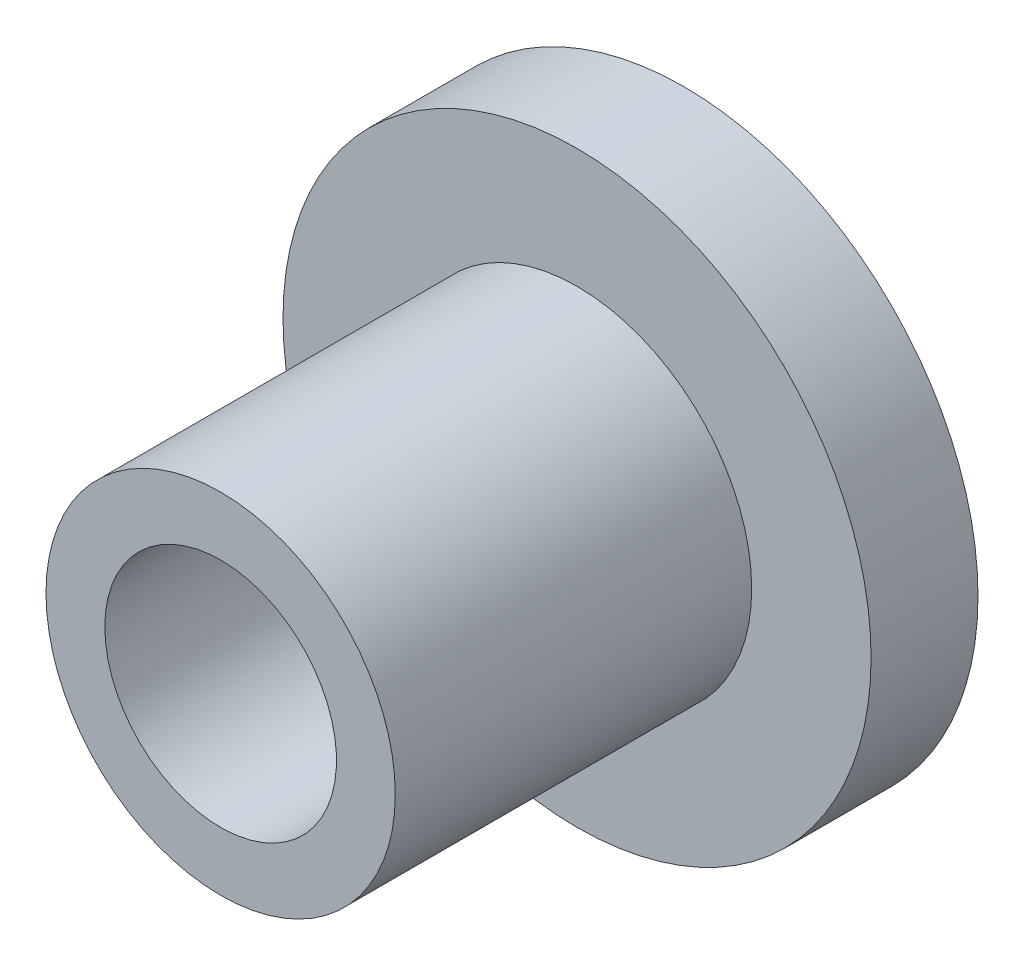
ISO-10303-21;
HEADER;
FILE_DESCRIPTION(('STEP AP214'),'2;1');
FILE_NAME('part.step','',(''),(''),'','','');
FILE_SCHEMA(('AUTOMOTIVE_DESIGN { 1 0 10303 214 1 1 1 1 }'));
ENDSEC;
DATA;
#1=APPLICATION_CONTEXT('core data for automotive mechanical design processes');
#2=APPLICATION_PROTOCOL_DEFINITION('international standard','automotive_design',2000,#1);
#3=PRODUCT_CONTEXT('',#1,'mechanical');
#4=PRODUCT('Part','Part','',(#3));
#5=PRODUCT_RELATED_PRODUCT_CATEGORY('part','',(#4));
#6=PRODUCT_DEFINITION_FORMATION('','',#4);
#7=PRODUCT_DEFINITION_CONTEXT('part definition',#1,'design');
#8=PRODUCT_DEFINITION('design','',#6,#7);
#9=PRODUCT_DEFINITION_SHAPE('','',#8);
#10=(LENGTH_UNIT() NAMED_UNIT(*) SI_UNIT(.MILLI.,.METRE.));
#11=(NAMED_UNIT(*) PLANE_ANGLE_UNIT() SI_UNIT($,.RADIAN.));
#12=(NAMED_UNIT(*) SI_UNIT($,.STERADIAN.) SOLID_ANGLE_UNIT());
#13=UNCERTAINTY_MEASURE_WITH_UNIT(LENGTH_MEASURE(1.E-05),#10,'distance_accuracy_value','');
#14=(GEOMETRIC_REPRESENTATION_CONTEXT(3) GLOBAL_UNCERTAINTY_ASSIGNED_CONTEXT((#13)) GLOBAL_UNIT_ASSIGNED_CONTEXT((#10,
#11,#12)) REPRESENTATION_CONTEXT('',''));
#15=CARTESIAN_POINT('',(0.,0.,0.));
#16=DIRECTION('',(0.,0.,1.));
#17=DIRECTION('',(1.,0.,0.));
#18=AXIS2_PLACEMENT_3D('',#15,#16,#17);
#19=CARTESIAN_POINT('',(0.,0.,13.));
#20=DIRECTION('',(0.,0.,1.));
#21=DIRECTION('',(1.,0.,0.));
#22=AXIS2_PLACEMENT_3D('',#19,#20,#21);
#23=PLANE('',#22);
#24=CARTESIAN_POINT('',(0.,0.,13.));
#25=DIRECTION('',(0.,0.,1.));
#26=DIRECTION('',(1.,0.,0.));
#27=AXIS2_PLACEMENT_3D('',#24,#25,#26);
#28=CIRCLE('',#27,3.25);
#29=CARTESIAN_POINT('',(-3.25,0.,13.));
#30=VERTEX_POINT('',#29);
#31=EDGE_CURVE('E51',#30,#30,#28,.T.);
#32=ORIENTED_EDGE('',*,*,#31,.F.);
#33=EDGE_LOOP('',(#32));
#34=FACE_BOUND('',#33,.T.);
#35=CARTESIAN_POINT('',(0.,0.,13.));
#36=DIRECTION('',(0.,0.,1.));
#37=DIRECTION('',(1.,0.,0.));
#38=AXIS2_PLACEMENT_3D('',#35,#36,#37);
#39=CIRCLE('',#38,4.9);
#40=CARTESIAN_POINT('',(-4.9,0.,13.));
#41=VERTEX_POINT('',#40);
#42=EDGE_CURVE('E47',#41,#41,#39,.T.);
#43=ORIENTED_EDGE('',*,*,#42,.T.);
#44=EDGE_LOOP('',(#43));
#45=FACE_BOUND('',#44,.T.);
#46=ADVANCED_FACE('F43',(#34,#45),#23,.T.);
#47=CARTESIAN_POINT('',(0.,0.,0.));
#48=DIRECTION('',(0.,0.,1.));
#49=DIRECTION('',(1.,0.,0.));
#50=AXIS2_PLACEMENT_3D('',#47,#48,#49);
#51=PLANE('',#50);
#52=CARTESIAN_POINT('',(0.,0.,0.));
#53=DIRECTION('',(0.,0.,1.));
#54=DIRECTION('',(1.,0.,0.));
#55=AXIS2_PLACEMENT_3D('',#52,#53,#54);
#56=CIRCLE('',#55,8.25);
#57=CARTESIAN_POINT('',(-8.25,0.,0.));
#58=VERTEX_POINT('',#57);
#59=EDGE_CURVE('E11',#58,#58,#56,.T.);
#60=ORIENTED_EDGE('',*,*,#59,.F.);
#61=EDGE_LOOP('',(#60));
#62=FACE_BOUND('',#61,.T.);
#63=CARTESIAN_POINT('',(0.,0.,0.));
#64=DIRECTION('',(0.,0.,1.));
#65=DIRECTION('',(1.,0.,0.));
#66=AXIS2_PLACEMENT_3D('',#63,#64,#65);
#67=CIRCLE('',#66,3.25);
#68=CARTESIAN_POINT('',(-3.25,0.,0.));
#69=VERTEX_POINT('',#68);
#70=EDGE_CURVE('E56',#69,#69,#67,.T.);
#71=ORIENTED_EDGE('',*,*,#70,.T.);
#72=EDGE_LOOP('',(#71));
#73=FACE_BOUND('',#72,.T.);
#74=ADVANCED_FACE('F83',(#62,#73),#51,.F.);
#75=CARTESIAN_POINT('',(0.,0.,13.));
#76=DIRECTION('',(0.,0.,-1.));
#77=DIRECTION('',(-1.,0.,0.));
#78=AXIS2_PLACEMENT_3D('',#75,#76,#77);
#79=CYLINDRICAL_SURFACE('',#78,8.25);
#80=CARTESIAN_POINT('',(0.,0.,3.));
#81=DIRECTION('',(0.,0.,-1.));
#82=DIRECTION('',(-1.,0.,0.));
#83=AXIS2_PLACEMENT_3D('',#80,#81,#82);
#84=CIRCLE('',#83,8.25);
#85=CARTESIAN_POINT('',(-8.25,0.,3.));
#86=VERTEX_POINT('',#85);
#87=EDGE_CURVE('E59',#86,#86,#84,.T.);
#88=CARTESIAN_POINT('',(-8.25,0.,3.));
#89=CARTESIAN_POINT('',(-8.25,0.,2.96875));
#90=CARTESIAN_POINT('',(-8.25,0.,2.9375));
#91=CARTESIAN_POINT('',(-8.25,0.,2.875));
#92=CARTESIAN_POINT('',(-8.25,0.,2.84375));
#93=CARTESIAN_POINT('',(-8.25,0.,2.78125));
#94=CARTESIAN_POINT('',(-8.25,0.,2.75));
#95=CARTESIAN_POINT('',(-8.25,0.,2.6875));
#96=CARTESIAN_POINT('',(-8.25,0.,2.65625));
#97=CARTESIAN_POINT('',(-8.25,0.,2.59375));
#98=CARTESIAN_POINT('',(-8.25,0.,2.5625));
#99=CARTESIAN_POINT('',(-8.25,0.,2.5));
#100=CARTESIAN_POINT('',(-8.25,0.,2.46875));
#101=CARTESIAN_POINT('',(-8.25,0.,2.40625));
#102=CARTESIAN_POINT('',(-8.25,0.,2.375));
#103=CARTESIAN_POINT('',(-8.25,0.,2.3125));
#104=CARTESIAN_POINT('',(-8.25,0.,2.28125));
#105=CARTESIAN_POINT('',(-8.25,0.,2.21875));
#106=CARTESIAN_POINT('',(-8.25,0.,2.1875));
#107=CARTESIAN_POINT('',(-8.25,0.,2.125));
#108=CARTESIAN_POINT('',(-8.25,0.,2.09375));
#109=CARTESIAN_POINT('',(-8.25,0.,2.03125));
#110=CARTESIAN_POINT('',(-8.25,0.,2.));
#111=CARTESIAN_POINT('',(-8.25,0.,1.9375));
#112=CARTESIAN_POINT('',(-8.25,0.,1.90625));
#113=CARTESIAN_POINT('',(-8.25,0.,1.84375));
#114=CARTESIAN_POINT('',(-8.25,0.,1.8125));
#115=CARTESIAN_POINT('',(-8.25,0.,1.75));
#116=CARTESIAN_POINT('',(-8.25,0.,1.71875));
#117=CARTESIAN_POINT('',(-8.25,0.,1.65625));
#118=CARTESIAN_POINT('',(-8.25,0.,1.625));
#119=CARTESIAN_POINT('',(-8.25,0.,1.5625));
#120=CARTESIAN_POINT('',(-8.25,0.,1.53125));
#121=CARTESIAN_POINT('',(-8.25,0.,1.46875));
#122=CARTESIAN_POINT('',(-8.25,0.,1.4375));
#123=CARTESIAN_POINT('',(-8.25,0.,1.375));
#124=CARTESIAN_POINT('',(-8.25,0.,1.34375));
#125=CARTESIAN_POINT('',(-8.25,0.,1.28125));
#126=CARTESIAN_POINT('',(-8.25,0.,1.25));
#127=CARTESIAN_POINT('',(-8.25,0.,1.1875));
#128=CARTESIAN_POINT('',(-8.25,0.,1.15625));
#129=CARTESIAN_POINT('',(-8.25,0.,1.09375));
#130=CARTESIAN_POINT('',(-8.25,0.,1.0625));
#131=CARTESIAN_POINT('',(-8.25,0.,1.));
#132=CARTESIAN_POINT('',(-8.25,0.,0.968750000000001));
#133=CARTESIAN_POINT('',(-8.25,0.,0.906250000000001));
#134=CARTESIAN_POINT('',(-8.25,0.,0.875000000000001));
#135=CARTESIAN_POINT('',(-8.25,0.,0.812500000000001));
#136=CARTESIAN_POINT('',(-8.25,0.,0.781250000000001));
#137=CARTESIAN_POINT('',(-8.25,0.,0.718750000000001));
#138=CARTESIAN_POINT('',(-8.25,0.,0.687500000000001));
#139=CARTESIAN_POINT('',(-8.25,0.,0.625000000000001));
#140=CARTESIAN_POINT('',(-8.25,0.,0.593750000000001));
#141=CARTESIAN_POINT('',(-8.25,0.,0.53125));
#142=CARTESIAN_POINT('',(-8.25,0.,0.5));
#143=CARTESIAN_POINT('',(-8.25,0.,0.4375));
#144=CARTESIAN_POINT('',(-8.25,0.,0.40625));
#145=CARTESIAN_POINT('',(-8.25,0.,0.34375));
#146=CARTESIAN_POINT('',(-8.25,0.,0.3125));
#147=CARTESIAN_POINT('',(-8.25,0.,0.25));
#148=CARTESIAN_POINT('',(-8.25,0.,0.21875));
#149=CARTESIAN_POINT('',(-8.25,0.,0.15625));
#150=CARTESIAN_POINT('',(-8.25,0.,0.125));
#151=CARTESIAN_POINT('',(-8.25,0.,0.0625000000000001));
#152=CARTESIAN_POINT('',(-8.25,0.,0.03125));
#153=CARTESIAN_POINT('',(-8.25,0.,0.));
#154=B_SPLINE_CURVE_WITH_KNOTS('',3,(#88,#89,#90,#91,#92,#93,#94,#95,#96,#97,#98,#99,#100,#101,
#102,#103,#104,#105,#106,#107,#108,#109,#110,#111,#112,#113,#114,#115,#116,#117,#118,#119,#120,
#121,#122,#123,#124,#125,#126,#127,#128,#129,#130,#131,#132,#133,#134,#135,#136,#137,#138,#139,
#140,#141,#142,#143,#144,#145,#146,#147,#148,#149,#150,#151,#152,#153),.UNSPECIFIED.,.F.,.F.,(4,
2,2,2,2,2,2,2,2,2,2,2,2,2,2,2,2,2,2,2,2,2,2,2,2,2,2,2,2,2,2,2,4),(0.,0.0937500000000001,0.1875,
0.28125,0.375,0.46875,0.5625,0.656250000000001,0.750000000000001,0.843750000000001,
0.937500000000001,1.03125,1.125,1.21875,1.3125,1.40625,1.5,1.59375,1.6875,1.78125,1.875,1.96875,
2.0625,2.15625,2.25,2.34375,2.4375,2.53125,2.625,2.71875,2.8125,2.90625,3.),.UNSPECIFIED.);
#155=EDGE_CURVE('BSEAM45',#86,#58,#154,.T.);
#156=ORIENTED_EDGE('',*,*,#87,.T.);
#157=ORIENTED_EDGE('',*,*,#59,.T.);
#158=ORIENTED_EDGE('',*,*,#155,.T.);
#159=ORIENTED_EDGE('',*,*,#155,.F.);
#160=EDGE_LOOP('',(#156,#158,#157,#159));
#161=FACE_BOUND('',#160,.T.);
#162=ADVANCED_FACE('F45',(#161),#79,.T.);
#163=CARTESIAN_POINT('',(0.,0.,13.));
#164=DIRECTION('',(0.,0.,-1.));
#165=DIRECTION('',(-1.,0.,0.));
#166=AXIS2_PLACEMENT_3D('',#163,#164,#165);
#167=CYLINDRICAL_SURFACE('',#166,3.25);
#168=CARTESIAN_POINT('',(-3.25,0.,13.));
#169=CARTESIAN_POINT('',(-3.25,0.,12.8645833333333));
#170=CARTESIAN_POINT('',(-3.25,0.,12.7291666666667));
#171=CARTESIAN_POINT('',(-3.25,0.,12.4583333333333));
#172=CARTESIAN_POINT('',(-3.25,0.,12.3229166666667));
#173=CARTESIAN_POINT('',(-3.25,0.,12.0520833333333));
#174=CARTESIAN_POINT('',(-3.25,0.,11.9166666666667));
#175=CARTESIAN_POINT('',(-3.25,0.,11.6458333333333));
#176=CARTESIAN_POINT('',(-3.25,0.,11.5104166666667));
#177=CARTESIAN_POINT('',(-3.25,0.,11.2395833333333));
#178=CARTESIAN_POINT('',(-3.25,0.,11.1041666666667));
#179=CARTESIAN_POINT('',(-3.25,0.,10.8333333333333));
#180=CARTESIAN_POINT('',(-3.25,0.,10.6979166666667));
#181=CARTESIAN_POINT('',(-3.25,0.,10.4270833333333));
#182=CARTESIAN_POINT('',(-3.25,0.,10.2916666666667));
#183=CARTESIAN_POINT('',(-3.25,0.,10.0208333333333));
#184=CARTESIAN_POINT('',(-3.25,0.,9.88541666666667));
#185=CARTESIAN_POINT('',(-3.25,0.,9.61458333333333));
#186=CARTESIAN_POINT('',(-3.25,0.,9.47916666666667));
#187=CARTESIAN_POINT('',(-3.25,0.,9.20833333333333));
#188=CARTESIAN_POINT('',(-3.25,0.,9.07291666666667));
#189=CARTESIAN_POINT('',(-3.25,0.,8.80208333333333));
#190=CARTESIAN_POINT('',(-3.25,0.,8.66666666666667));
#191=CARTESIAN_POINT('',(-3.25,0.,8.39583333333333));
#192=CARTESIAN_POINT('',(-3.25,0.,8.26041666666667));
#193=CARTESIAN_POINT('',(-3.25,0.,7.98958333333333));
#194=CARTESIAN_POINT('',(-3.25,0.,7.85416666666667));
#195=CARTESIAN_POINT('',(-3.25,0.,7.58333333333333));
#196=CARTESIAN_POINT('',(-3.25,0.,7.44791666666667));
#197=CARTESIAN_POINT('',(-3.25,0.,7.17708333333333));
#198=CARTESIAN_POINT('',(-3.25,0.,7.04166666666667));
#199=CARTESIAN_POINT('',(-3.25,0.,6.77083333333333));
#200=CARTESIAN_POINT('',(-3.25,0.,6.63541666666667));
#201=CARTESIAN_POINT('',(-3.25,0.,6.36458333333333));
#202=CARTESIAN_POINT('',(-3.25,0.,6.22916666666667));
#203=CARTESIAN_POINT('',(-3.25,0.,5.95833333333333));
#204=CARTESIAN_POINT('',(-3.25,0.,5.82291666666667));
#205=CARTESIAN_POINT('',(-3.25,0.,5.55208333333333));
#206=CARTESIAN_POINT('',(-3.25,0.,5.41666666666667));
#207=CARTESIAN_POINT('',(-3.25,0.,5.14583333333333));
#208=CARTESIAN_POINT('',(-3.25,0.,5.01041666666667));
#209=CARTESIAN_POINT('',(-3.25,0.,4.73958333333333));
#210=CARTESIAN_POINT('',(-3.25,0.,4.60416666666667));
#211=CARTESIAN_POINT('',(-3.25,0.,4.33333333333333));
#212=CARTESIAN_POINT('',(-3.25,0.,4.19791666666667));
#213=CARTESIAN_POINT('',(-3.25,0.,3.92708333333333));
#214=CARTESIAN_POINT('',(-3.25,0.,3.79166666666667));
#215=CARTESIAN_POINT('',(-3.25,0.,3.52083333333333));
#216=CARTESIAN_POINT('',(-3.25,0.,3.38541666666667));
#217=CARTESIAN_POINT('',(-3.25,0.,3.11458333333333));
#218=CARTESIAN_POINT('',(-3.25,0.,2.97916666666667));
#219=CARTESIAN_POINT('',(-3.25,0.,2.70833333333333));
#220=CARTESIAN_POINT('',(-3.25,0.,2.57291666666667));
#221=CARTESIAN_POINT('',(-3.25,0.,2.30208333333333));
#222=CARTESIAN_POINT('',(-3.25,0.,2.16666666666667));
#223=CARTESIAN_POINT('',(-3.25,0.,1.89583333333333));
#224=CARTESIAN_POINT('',(-3.25,0.,1.76041666666667));
#225=CARTESIAN_POINT('',(-3.25,0.,1.48958333333333));
#226=CARTESIAN_POINT('',(-3.25,0.,1.35416666666667));
#227=CARTESIAN_POINT('',(-3.25,0.,1.08333333333333));
#228=CARTESIAN_POINT('',(-3.25,0.,0.947916666666667));
#229=CARTESIAN_POINT('',(-3.25,0.,0.677083333333334));
#230=CARTESIAN_POINT('',(-3.25,0.,0.541666666666667));
#231=CARTESIAN_POINT('',(-3.25,0.,0.270833333333334));
#232=CARTESIAN_POINT('',(-3.25,0.,0.135416666666667));
#233=CARTESIAN_POINT('',(-3.25,0.,0.));
#234=B_SPLINE_CURVE_WITH_KNOTS('',3,(#168,#169,#170,#171,#172,#173,#174,#175,#176,#177,#178,
#179,#180,#181,#182,#183,#184,#185,#186,#187,#188,#189,#190,#191,#192,#193,#194,#195,#196,#197,
#198,#199,#200,#201,#202,#203,#204,#205,#206,#207,#208,#209,#210,#211,#212,#213,#214,#215,#216,
#217,#218,#219,#220,#221,#222,#223,#224,#225,#226,#227,#228,#229,#230,#231,#232,#233),
.UNSPECIFIED.,.F.,.F.,(4,2,2,2,2,2,2,2,2,2,2,2,2,2,2,2,2,2,2,2,2,2,2,2,2,2,2,2,2,2,2,2,4),(0.,
0.406249999999999,0.812499999999999,1.21875,1.625,2.03125,2.4375,2.84375,3.25,3.65625,4.0625,
4.46875,4.875,5.28125,5.6875,6.09375,6.5,6.90625,7.3125,7.71875,8.125,8.53125,8.9375,9.34375,
9.75,10.15625,10.5625,10.96875,11.375,11.78125,12.1875,12.59375,13.),.UNSPECIFIED.);
#235=EDGE_CURVE('BSEAM79',#30,#69,#234,.T.);
#236=ORIENTED_EDGE('',*,*,#31,.T.);
#237=ORIENTED_EDGE('',*,*,#70,.F.);
#238=ORIENTED_EDGE('',*,*,#235,.T.);
#239=ORIENTED_EDGE('',*,*,#235,.F.);
#240=EDGE_LOOP('',(#236,#238,#237,#239));
#241=FACE_BOUND('',#240,.T.);
#242=ADVANCED_FACE('F79',(#241),#167,.F.);
#243=CARTESIAN_POINT('',(0.,0.,3.));
#244=DIRECTION('',(0.,0.,-1.));
#245=DIRECTION('',(-1.,0.,0.));
#246=AXIS2_PLACEMENT_3D('',#243,#244,#245);
#247=PLANE('',#246);
#248=CARTESIAN_POINT('',(0.,0.,3.));
#249=DIRECTION('',(0.,0.,-1.));
#250=DIRECTION('',(-1.,0.,0.));
#251=AXIS2_PLACEMENT_3D('',#248,#249,#250);
#252=CIRCLE('',#251,4.9);
#253=CARTESIAN_POINT('',(-4.9,0.,3.));
#254=VERTEX_POINT('',#253);
#255=EDGE_CURVE('E61',#254,#254,#252,.T.);
#256=ORIENTED_EDGE('',*,*,#255,.T.);
#257=EDGE_LOOP('',(#256));
#258=FACE_BOUND('',#257,.T.);
#259=ORIENTED_EDGE('',*,*,#87,.F.);
#260=EDGE_LOOP('',(#259));
#261=FACE_BOUND('',#260,.T.);
#262=ADVANCED_FACE('F69',(#258,#261),#247,.F.);
#263=CARTESIAN_POINT('',(0.,0.,16.));
#264=DIRECTION('',(0.,0.,-1.));
#265=DIRECTION('',(-1.,0.,0.));
#266=AXIS2_PLACEMENT_3D('',#263,#264,#265);
#267=CYLINDRICAL_SURFACE('',#266,4.9);
#268=CARTESIAN_POINT('',(-4.9,0.,13.));
#269=CARTESIAN_POINT('',(-4.9,0.,12.8958333333333));
#270=CARTESIAN_POINT('',(-4.9,0.,12.7916666666667));
#271=CARTESIAN_POINT('',(-4.9,0.,12.5833333333333));
#272=CARTESIAN_POINT('',(-4.9,0.,12.4791666666667));
#273=CARTESIAN_POINT('',(-4.9,0.,12.2708333333333));
#274=CARTESIAN_POINT('',(-4.9,0.,12.1666666666667));
#275=CARTESIAN_POINT('',(-4.9,0.,11.9583333333333));
#276=CARTESIAN_POINT('',(-4.9,0.,11.8541666666667));
#277=CARTESIAN_POINT('',(-4.9,0.,11.6458333333333));
#278=CARTESIAN_POINT('',(-4.9,0.,11.5416666666667));
#279=CARTESIAN_POINT('',(-4.9,0.,11.3333333333333));
#280=CARTESIAN_POINT('',(-4.9,0.,11.2291666666667));
#281=CARTESIAN_POINT('',(-4.9,0.,11.0208333333333));
#282=CARTESIAN_POINT('',(-4.9,0.,10.9166666666667));
#283=CARTESIAN_POINT('',(-4.9,0.,10.7083333333333));
#284=CARTESIAN_POINT('',(-4.9,0.,10.6041666666667));
#285=CARTESIAN_POINT('',(-4.9,0.,10.3958333333333));
#286=CARTESIAN_POINT('',(-4.9,0.,10.2916666666667));
#287=CARTESIAN_POINT('',(-4.9,0.,10.0833333333333));
#288=CARTESIAN_POINT('',(-4.9,0.,9.97916666666667));
#289=CARTESIAN_POINT('',(-4.9,0.,9.77083333333333));
#290=CARTESIAN_POINT('',(-4.9,0.,9.66666666666667));
#291=CARTESIAN_POINT('',(-4.9,0.,9.45833333333333));
#292=CARTESIAN_POINT('',(-4.9,0.,9.35416666666667));
#293=CARTESIAN_POINT('',(-4.9,0.,9.14583333333333));
#294=CARTESIAN_POINT('',(-4.9,0.,9.04166666666667));
#295=CARTESIAN_POINT('',(-4.9,0.,8.83333333333333));
#296=CARTESIAN_POINT('',(-4.9,0.,8.72916666666667));
#297=CARTESIAN_POINT('',(-4.9,0.,8.52083333333333));
#298=CARTESIAN_POINT('',(-4.9,0.,8.41666666666667));
#299=CARTESIAN_POINT('',(-4.9,0.,8.20833333333334));
#300=CARTESIAN_POINT('',(-4.9,0.,8.10416666666667));
#301=CARTESIAN_POINT('',(-4.9,0.,7.89583333333333));
#302=CARTESIAN_POINT('',(-4.9,0.,7.79166666666667));
#303=CARTESIAN_POINT('',(-4.9,0.,7.58333333333333));
#304=CARTESIAN_POINT('',(-4.9,0.,7.47916666666667));
#305=CARTESIAN_POINT('',(-4.9,0.,7.27083333333333));
#306=CARTESIAN_POINT('',(-4.9,0.,7.16666666666667));
#307=CARTESIAN_POINT('',(-4.9,0.,6.95833333333333));
#308=CARTESIAN_POINT('',(-4.9,0.,6.85416666666667));
#309=CARTESIAN_POINT('',(-4.9,0.,6.64583333333333));
#310=CARTESIAN_POINT('',(-4.9,0.,6.54166666666667));
#311=CARTESIAN_POINT('',(-4.9,0.,6.33333333333333));
#312=CARTESIAN_POINT('',(-4.9,0.,6.22916666666667));
#313=CARTESIAN_POINT('',(-4.9,0.,6.02083333333333));
#314=CARTESIAN_POINT('',(-4.9,0.,5.91666666666667));
#315=CARTESIAN_POINT('',(-4.9,0.,5.70833333333333));
#316=CARTESIAN_POINT('',(-4.9,0.,5.60416666666667));
#317=CARTESIAN_POINT('',(-4.9,0.,5.39583333333333));
#318=CARTESIAN_POINT('',(-4.9,0.,5.29166666666667));
#319=CARTESIAN_POINT('',(-4.9,0.,5.08333333333333));
#320=CARTESIAN_POINT('',(-4.9,0.,4.97916666666667));
#321=CARTESIAN_POINT('',(-4.9,0.,4.77083333333334));
#322=CARTESIAN_POINT('',(-4.9,0.,4.66666666666667));
#323=CARTESIAN_POINT('',(-4.9,0.,4.45833333333334));
#324=CARTESIAN_POINT('',(-4.9,0.,4.35416666666667));
#325=CARTESIAN_POINT('',(-4.9,0.,4.14583333333334));
#326=CARTESIAN_POINT('',(-4.9,0.,4.04166666666667));
#327=CARTESIAN_POINT('',(-4.9,0.,3.83333333333333));
#328=CARTESIAN_POINT('',(-4.9,0.,3.72916666666667));
#329=CARTESIAN_POINT('',(-4.9,0.,3.52083333333333));
#330=CARTESIAN_POINT('',(-4.9,0.,3.41666666666667));
#331=CARTESIAN_POINT('',(-4.9,0.,3.20833333333333));
#332=CARTESIAN_POINT('',(-4.9,0.,3.10416666666667));
#333=CARTESIAN_POINT('',(-4.9,0.,3.));
#334=B_SPLINE_CURVE_WITH_KNOTS('',3,(#268,#269,#270,#271,#272,#273,#274,#275,#276,#277,#278,
#279,#280,#281,#282,#283,#284,#285,#286,#287,#288,#289,#290,#291,#292,#293,#294,#295,#296,#297,
#298,#299,#300,#301,#302,#303,#304,#305,#306,#307,#308,#309,#310,#311,#312,#313,#314,#315,#316,
#317,#318,#319,#320,#321,#322,#323,#324,#325,#326,#327,#328,#329,#330,#331,#332,#333),
.UNSPECIFIED.,.F.,.F.,(4,2,2,2,2,2,2,2,2,2,2,2,2,2,2,2,2,2,2,2,2,2,2,2,2,2,2,2,2,2,2,2,4),(0.,
0.3125,0.625000000000001,0.937499999999999,1.25,1.5625,1.875,2.1875,2.5,2.8125,3.125,3.4375,
3.75,4.0625,4.375,4.6875,5.,5.3125,5.625,5.9375,6.25,6.5625,6.875,7.1875,7.5,7.8125,8.125,
8.4375,8.75,9.0625,9.375,9.6875,10.),.UNSPECIFIED.);
#335=EDGE_CURVE('BSEAM72',#41,#254,#334,.T.);
#336=ORIENTED_EDGE('',*,*,#42,.F.);
#337=ORIENTED_EDGE('',*,*,#255,.F.);
#338=ORIENTED_EDGE('',*,*,#335,.T.);
#339=ORIENTED_EDGE('',*,*,#335,.F.);
#340=EDGE_LOOP('',(#336,#338,#337,#339));
#341=FACE_BOUND('',#340,.T.);
#342=ADVANCED_FACE('F72',(#341),#267,.T.);
#343=CLOSED_SHELL('',(#46,#74,#162,#242,#262,#342));
#344=MANIFOLD_SOLID_BREP('B2',#343);
#345=ADVANCED_BREP_SHAPE_REPRESENTATION('',(#18,#344),#14);
#346=SHAPE_DEFINITION_REPRESENTATION(#9,#345);
ENDSEC;
END-ISO-10303-21;
